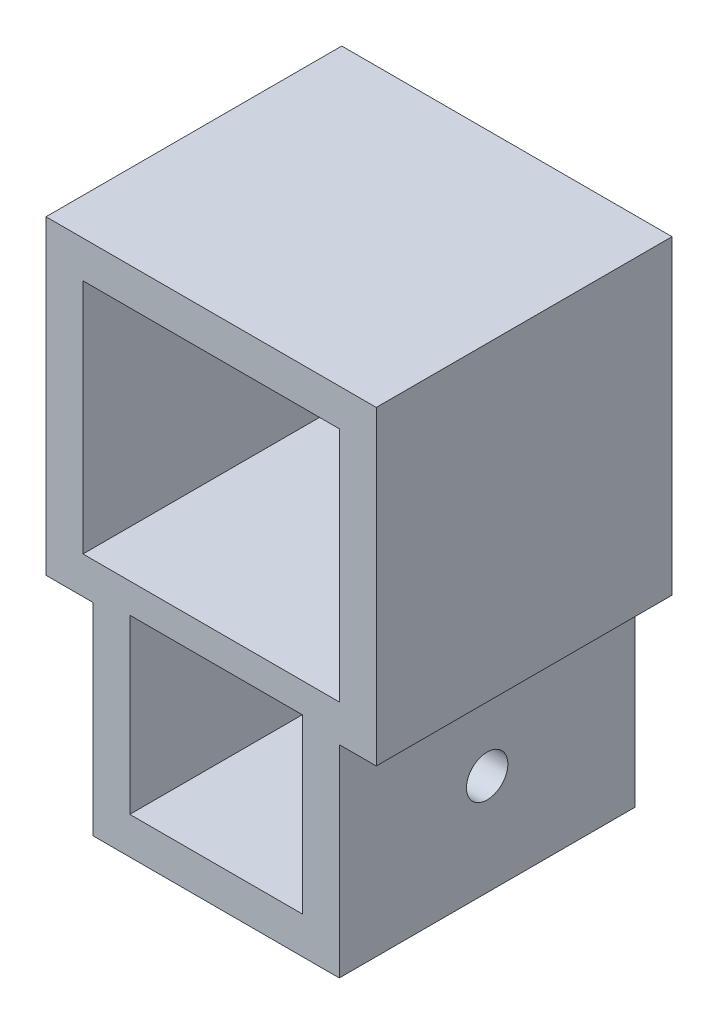
ISO-10303-21;
HEADER;
FILE_DESCRIPTION(('STEP AP214'),'2;1');
FILE_NAME('part.step','',(''),(''),'','','');
FILE_SCHEMA(('AUTOMOTIVE_DESIGN { 1 0 10303 214 1 1 1 1 }'));
ENDSEC;
DATA;
#1=APPLICATION_CONTEXT('core data for automotive mechanical design processes');
#2=APPLICATION_PROTOCOL_DEFINITION('international standard','automotive_design',2000,#1);
#3=PRODUCT_CONTEXT('',#1,'mechanical');
#4=PRODUCT('Part','Part','',(#3));
#5=PRODUCT_RELATED_PRODUCT_CATEGORY('part','',(#4));
#6=PRODUCT_DEFINITION_FORMATION('','',#4);
#7=PRODUCT_DEFINITION_CONTEXT('part definition',#1,'design');
#8=PRODUCT_DEFINITION('design','',#6,#7);
#9=PRODUCT_DEFINITION_SHAPE('','',#8);
#10=(LENGTH_UNIT() NAMED_UNIT(*) SI_UNIT(.MILLI.,.METRE.));
#11=(NAMED_UNIT(*) PLANE_ANGLE_UNIT() SI_UNIT($,.RADIAN.));
#12=(NAMED_UNIT(*) SI_UNIT($,.STERADIAN.) SOLID_ANGLE_UNIT());
#13=UNCERTAINTY_MEASURE_WITH_UNIT(LENGTH_MEASURE(1.E-05),#10,'distance_accuracy_value','');
#14=(GEOMETRIC_REPRESENTATION_CONTEXT(3) GLOBAL_UNCERTAINTY_ASSIGNED_CONTEXT((#13)) GLOBAL_UNIT_ASSIGNED_CONTEXT((#10,
#11,#12)) REPRESENTATION_CONTEXT('',''));
#15=CARTESIAN_POINT('',(0.,0.,0.));
#16=DIRECTION('',(0.,0.,1.));
#17=DIRECTION('',(1.,0.,0.));
#18=AXIS2_PLACEMENT_3D('',#15,#16,#17);
#19=CARTESIAN_POINT('',(0.,0.,30.));
#20=DIRECTION('',(0.,0.,-1.));
#21=DIRECTION('',(-1.,0.,0.));
#22=AXIS2_PLACEMENT_3D('',#19,#20,#21);
#23=PLANE('',#22);
#24=DIRECTION('',(0.,-1.,0.));
#25=VECTOR('',#24,1.);
#26=CARTESIAN_POINT('',(-25.,15.4435483870968,30.));
#27=LINE('',#26,#25);
#28=CARTESIAN_POINT('',(-25.,16.1935483870968,30.));
#29=VERTEX_POINT('',#28);
#30=CARTESIAN_POINT('',(-25.,-1.30645161290323,30.));
#31=VERTEX_POINT('',#30);
#32=EDGE_CURVE('E182',#29,#31,#27,.T.);
#33=ORIENTED_EDGE('',*,*,#32,.F.);
#34=DIRECTION('',(-1.,0.,0.));
#35=VECTOR('',#34,1.);
#36=CARTESIAN_POINT('',(-25.,16.1935483870968,30.));
#37=LINE('',#36,#35);
#38=CARTESIAN_POINT('',(-7.49999999999999,16.1935483870968,30.));
#39=VERTEX_POINT('',#38);
#40=EDGE_CURVE('E190',#39,#29,#37,.T.);
#41=ORIENTED_EDGE('',*,*,#40,.F.);
#42=DIRECTION('',(0.,1.,0.));
#43=VECTOR('',#42,1.);
#44=CARTESIAN_POINT('',(-7.49999999999999,15.4435483870968,30.));
#45=LINE('',#44,#43);
#46=CARTESIAN_POINT('',(-7.49999999999999,-1.30645161290323,30.));
#47=VERTEX_POINT('',#46);
#48=EDGE_CURVE('E187',#47,#39,#45,.T.);
#49=ORIENTED_EDGE('',*,*,#48,.F.);
#50=DIRECTION('',(1.,0.,0.));
#51=VECTOR('',#50,1.);
#52=CARTESIAN_POINT('',(-25.,-1.30645161290323,30.));
#53=LINE('',#52,#51);
#54=EDGE_CURVE('E184',#31,#47,#53,.T.);
#55=ORIENTED_EDGE('',*,*,#54,.F.);
#56=EDGE_LOOP('',(#33,#41,#49,#55));
#57=FACE_BOUND('',#56,.T.);
#58=DIRECTION('',(1.,0.,0.));
#59=VECTOR('',#58,1.);
#60=CARTESIAN_POINT('',(-28.75,15.4435483870968,30.));
#61=LINE('',#60,#59);
#62=CARTESIAN_POINT('',(-33.5,15.4435483870968,30.));
#63=VERTEX_POINT('',#62);
#64=CARTESIAN_POINT('',(-28.75,15.4435483870968,30.));
#65=VERTEX_POINT('',#64);
#66=EDGE_CURVE('E212',#63,#65,#61,.T.);
#67=ORIENTED_EDGE('',*,*,#66,.T.);
#68=DIRECTION('',(0.,-1.,0.));
#69=VECTOR('',#68,1.);
#70=CARTESIAN_POINT('',(-28.75,15.4435483870968,30.));
#71=LINE('',#70,#69);
#72=CARTESIAN_POINT('',(-28.75,-5.05645161290323,30.));
#73=VERTEX_POINT('',#72);
#74=EDGE_CURVE('E215',#65,#73,#71,.T.);
#75=ORIENTED_EDGE('',*,*,#74,.T.);
#76=DIRECTION('',(1.,0.,0.));
#77=VECTOR('',#76,1.);
#78=CARTESIAN_POINT('',(-28.75,-5.05645161290323,30.));
#79=LINE('',#78,#77);
#80=CARTESIAN_POINT('',(-3.74999999999998,-5.05645161290323,30.));
#81=VERTEX_POINT('',#80);
#82=EDGE_CURVE('E218',#73,#81,#79,.T.);
#83=ORIENTED_EDGE('',*,*,#82,.T.);
#84=DIRECTION('',(0.,1.,0.));
#85=VECTOR('',#84,1.);
#86=CARTESIAN_POINT('',(-3.74999999999999,15.4435483870968,30.));
#87=LINE('',#86,#85);
#88=CARTESIAN_POINT('',(-3.74999999999999,15.4435483870968,30.));
#89=VERTEX_POINT('',#88);
#90=EDGE_CURVE('E220',#81,#89,#87,.T.);
#91=ORIENTED_EDGE('',*,*,#90,.T.);
#92=DIRECTION('',(1.,0.,0.));
#93=VECTOR('',#92,1.);
#94=CARTESIAN_POINT('',(0.,15.4435483870968,30.));
#95=LINE('',#94,#93);
#96=CARTESIAN_POINT('',(0.,15.4435483870968,30.));
#97=VERTEX_POINT('',#96);
#98=EDGE_CURVE('E222',#89,#97,#95,.T.);
#99=ORIENTED_EDGE('',*,*,#98,.T.);
#100=DIRECTION('',(0.,1.,0.));
#101=VECTOR('',#100,1.);
#102=CARTESIAN_POINT('',(0.,46.9435483870968,30.));
#103=LINE('',#102,#101);
#104=CARTESIAN_POINT('',(0.,46.9435483870968,30.));
#105=VERTEX_POINT('',#104);
#106=EDGE_CURVE('E224',#97,#105,#103,.T.);
#107=ORIENTED_EDGE('',*,*,#106,.T.);
#108=DIRECTION('',(-1.,0.,0.));
#109=VECTOR('',#108,1.);
#110=CARTESIAN_POINT('',(-33.5,46.9435483870968,30.));
#111=LINE('',#110,#109);
#112=CARTESIAN_POINT('',(-33.5,46.9435483870968,30.));
#113=VERTEX_POINT('',#112);
#114=EDGE_CURVE('E226',#105,#113,#111,.T.);
#115=ORIENTED_EDGE('',*,*,#114,.T.);
#116=DIRECTION('',(0.,-1.,0.));
#117=VECTOR('',#116,1.);
#118=CARTESIAN_POINT('',(-33.5,15.4435483870968,30.));
#119=LINE('',#118,#117);
#120=EDGE_CURVE('E228',#113,#63,#119,.T.);
#121=ORIENTED_EDGE('',*,*,#120,.T.);
#122=EDGE_LOOP('',(#67,#75,#83,#91,#99,#107,#115,#121));
#123=FACE_BOUND('',#122,.T.);
#124=DIRECTION('',(0.,1.,0.));
#125=VECTOR('',#124,1.);
#126=CARTESIAN_POINT('',(-3.75,43.1935483870968,30.));
#127=LINE('',#126,#125);
#128=CARTESIAN_POINT('',(-3.74999999999999,19.1935483870968,30.));
#129=VERTEX_POINT('',#128);
#130=CARTESIAN_POINT('',(-3.75,43.1935483870968,30.));
#131=VERTEX_POINT('',#130);
#132=EDGE_CURVE('E153',#129,#131,#127,.T.);
#133=ORIENTED_EDGE('',*,*,#132,.F.);
#134=DIRECTION('',(1.,0.,0.));
#135=VECTOR('',#134,1.);
#136=CARTESIAN_POINT('',(-25.,19.1935483870968,30.));
#137=LINE('',#136,#135);
#138=CARTESIAN_POINT('',(-29.75,19.1935483870968,30.));
#139=VERTEX_POINT('',#138);
#140=EDGE_CURVE('E146',#139,#129,#137,.T.);
#141=ORIENTED_EDGE('',*,*,#140,.F.);
#142=DIRECTION('',(0.,-1.,0.));
#143=VECTOR('',#142,1.);
#144=CARTESIAN_POINT('',(-29.75,19.1935483870968,30.));
#145=LINE('',#144,#143);
#146=CARTESIAN_POINT('',(-29.75,43.1935483870968,30.));
#147=VERTEX_POINT('',#146);
#148=EDGE_CURVE('E164',#147,#139,#145,.T.);
#149=ORIENTED_EDGE('',*,*,#148,.F.);
#150=DIRECTION('',(-1.,0.,0.));
#151=VECTOR('',#150,1.);
#152=CARTESIAN_POINT('',(-29.75,43.1935483870968,30.));
#153=LINE('',#152,#151);
#154=EDGE_CURVE('E162',#131,#147,#153,.T.);
#155=ORIENTED_EDGE('',*,*,#154,.F.);
#156=EDGE_LOOP('',(#133,#141,#149,#155));
#157=FACE_BOUND('',#156,.T.);
#158=ADVANCED_FACE('F33',(#57,#123,#157),#23,.F.);
#159=CARTESIAN_POINT('',(0.,0.,0.));
#160=DIRECTION('',(0.,0.,-1.));
#161=DIRECTION('',(-1.,0.,0.));
#162=AXIS2_PLACEMENT_3D('',#159,#160,#161);
#163=PLANE('',#162);
#164=DIRECTION('',(1.,0.,0.));
#165=VECTOR('',#164,1.);
#166=CARTESIAN_POINT('',(-28.75,15.4435483870968,0.));
#167=LINE('',#166,#165);
#168=CARTESIAN_POINT('',(-33.5,15.4435483870968,0.));
#169=VERTEX_POINT('',#168);
#170=CARTESIAN_POINT('',(-28.75,15.4435483870968,0.));
#171=VERTEX_POINT('',#170);
#172=EDGE_CURVE('E211',#169,#171,#167,.T.);
#173=ORIENTED_EDGE('',*,*,#172,.F.);
#174=DIRECTION('',(0.,-1.,0.));
#175=VECTOR('',#174,1.);
#176=CARTESIAN_POINT('',(-33.5,15.4435483870968,0.));
#177=LINE('',#176,#175);
#178=CARTESIAN_POINT('',(-33.5,46.9435483870968,0.));
#179=VERTEX_POINT('',#178);
#180=EDGE_CURVE('E216',#179,#169,#177,.T.);
#181=ORIENTED_EDGE('',*,*,#180,.F.);
#182=DIRECTION('',(-1.,0.,0.));
#183=VECTOR('',#182,1.);
#184=CARTESIAN_POINT('',(-33.5,46.9435483870968,0.));
#185=LINE('',#184,#183);
#186=CARTESIAN_POINT('',(0.,46.9435483870968,0.));
#187=VERTEX_POINT('',#186);
#188=EDGE_CURVE('E243',#187,#179,#185,.T.);
#189=ORIENTED_EDGE('',*,*,#188,.F.);
#190=DIRECTION('',(0.,1.,0.));
#191=VECTOR('',#190,1.);
#192=CARTESIAN_POINT('',(0.,46.9435483870968,0.));
#193=LINE('',#192,#191);
#194=CARTESIAN_POINT('',(0.,15.4435483870968,0.));
#195=VERTEX_POINT('',#194);
#196=EDGE_CURVE('E241',#195,#187,#193,.T.);
#197=ORIENTED_EDGE('',*,*,#196,.F.);
#198=DIRECTION('',(1.,0.,0.));
#199=VECTOR('',#198,1.);
#200=CARTESIAN_POINT('',(0.,15.4435483870968,0.));
#201=LINE('',#200,#199);
#202=CARTESIAN_POINT('',(-3.74999999999999,15.4435483870968,0.));
#203=VERTEX_POINT('',#202);
#204=EDGE_CURVE('E239',#203,#195,#201,.T.);
#205=ORIENTED_EDGE('',*,*,#204,.F.);
#206=DIRECTION('',(0.,1.,0.));
#207=VECTOR('',#206,1.);
#208=CARTESIAN_POINT('',(-3.74999999999999,15.4435483870968,0.));
#209=LINE('',#208,#207);
#210=CARTESIAN_POINT('',(-3.74999999999998,-5.05645161290323,0.));
#211=VERTEX_POINT('',#210);
#212=EDGE_CURVE('E237',#211,#203,#209,.T.);
#213=ORIENTED_EDGE('',*,*,#212,.F.);
#214=DIRECTION('',(1.,0.,0.));
#215=VECTOR('',#214,1.);
#216=CARTESIAN_POINT('',(-28.75,-5.05645161290323,0.));
#217=LINE('',#216,#215);
#218=CARTESIAN_POINT('',(-28.75,-5.05645161290323,0.));
#219=VERTEX_POINT('',#218);
#220=EDGE_CURVE('E235',#219,#211,#217,.T.);
#221=ORIENTED_EDGE('',*,*,#220,.F.);
#222=DIRECTION('',(0.,-1.,0.));
#223=VECTOR('',#222,1.);
#224=CARTESIAN_POINT('',(-28.75,15.4435483870968,0.));
#225=LINE('',#224,#223);
#226=EDGE_CURVE('E233',#171,#219,#225,.T.);
#227=ORIENTED_EDGE('',*,*,#226,.F.);
#228=EDGE_LOOP('',(#173,#181,#189,#197,#205,#213,#221,#227));
#229=FACE_BOUND('',#228,.T.);
#230=DIRECTION('',(-1.,0.,0.));
#231=VECTOR('',#230,1.);
#232=CARTESIAN_POINT('',(-25.,16.1935483870968,0.));
#233=LINE('',#232,#231);
#234=CARTESIAN_POINT('',(-7.49999999999999,16.1935483870968,0.));
#235=VERTEX_POINT('',#234);
#236=CARTESIAN_POINT('',(-25.,16.1935483870968,0.));
#237=VERTEX_POINT('',#236);
#238=EDGE_CURVE('E185',#235,#237,#233,.T.);
#239=ORIENTED_EDGE('',*,*,#238,.T.);
#240=DIRECTION('',(0.,-1.,0.));
#241=VECTOR('',#240,1.);
#242=CARTESIAN_POINT('',(-25.,15.4435483870968,0.));
#243=LINE('',#242,#241);
#244=CARTESIAN_POINT('',(-25.,-1.30645161290323,0.));
#245=VERTEX_POINT('',#244);
#246=EDGE_CURVE('E158',#237,#245,#243,.T.);
#247=ORIENTED_EDGE('',*,*,#246,.T.);
#248=DIRECTION('',(1.,0.,0.));
#249=VECTOR('',#248,1.);
#250=CARTESIAN_POINT('',(-25.,-1.30645161290323,0.));
#251=LINE('',#250,#249);
#252=CARTESIAN_POINT('',(-7.49999999999999,-1.30645161290323,0.));
#253=VERTEX_POINT('',#252);
#254=EDGE_CURVE('E195',#245,#253,#251,.T.);
#255=ORIENTED_EDGE('',*,*,#254,.T.);
#256=DIRECTION('',(0.,1.,0.));
#257=VECTOR('',#256,1.);
#258=CARTESIAN_POINT('',(-7.49999999999999,16.1935483870968,0.));
#259=LINE('',#258,#257);
#260=EDGE_CURVE('E198',#253,#235,#259,.T.);
#261=ORIENTED_EDGE('',*,*,#260,.T.);
#262=EDGE_LOOP('',(#239,#247,#255,#261));
#263=FACE_BOUND('',#262,.T.);
#264=DIRECTION('',(1.,0.,0.));
#265=VECTOR('',#264,1.);
#266=CARTESIAN_POINT('',(-25.,19.1935483870968,0.));
#267=LINE('',#266,#265);
#268=CARTESIAN_POINT('',(-29.75,19.1935483870968,0.));
#269=VERTEX_POINT('',#268);
#270=CARTESIAN_POINT('',(-3.74999999999999,19.1935483870968,0.));
#271=VERTEX_POINT('',#270);
#272=EDGE_CURVE('E154',#269,#271,#267,.T.);
#273=ORIENTED_EDGE('',*,*,#272,.T.);
#274=DIRECTION('',(0.,1.,0.));
#275=VECTOR('',#274,1.);
#276=CARTESIAN_POINT('',(-3.75,43.1935483870968,0.));
#277=LINE('',#276,#275);
#278=CARTESIAN_POINT('',(-3.75,43.1935483870968,0.));
#279=VERTEX_POINT('',#278);
#280=EDGE_CURVE('E57',#271,#279,#277,.T.);
#281=ORIENTED_EDGE('',*,*,#280,.T.);
#282=DIRECTION('',(-1.,0.,0.));
#283=VECTOR('',#282,1.);
#284=CARTESIAN_POINT('',(-29.75,43.1935483870968,0.));
#285=LINE('',#284,#283);
#286=CARTESIAN_POINT('',(-29.75,43.1935483870968,0.));
#287=VERTEX_POINT('',#286);
#288=EDGE_CURVE('E170',#279,#287,#285,.T.);
#289=ORIENTED_EDGE('',*,*,#288,.T.);
#290=DIRECTION('',(0.,-1.,0.));
#291=VECTOR('',#290,1.);
#292=CARTESIAN_POINT('',(-29.75,19.1935483870968,0.));
#293=LINE('',#292,#291);
#294=EDGE_CURVE('E174',#287,#269,#293,.T.);
#295=ORIENTED_EDGE('',*,*,#294,.T.);
#296=EDGE_LOOP('',(#273,#281,#289,#295));
#297=FACE_BOUND('',#296,.T.);
#298=ADVANCED_FACE('F274',(#229,#263,#297),#163,.T.);
#299=CARTESIAN_POINT('',(-28.75,15.4435483870968,30.));
#300=DIRECTION('',(0.,1.,0.));
#301=DIRECTION('',(0.,0.,1.));
#302=AXIS2_PLACEMENT_3D('',#299,#300,#301);
#303=PLANE('',#302);
#304=ORIENTED_EDGE('',*,*,#172,.T.);
#305=DIRECTION('',(0.,0.,-1.));
#306=VECTOR('',#305,1.);
#307=CARTESIAN_POINT('',(-28.75,15.4435483870968,30.));
#308=LINE('',#307,#306);
#309=EDGE_CURVE('E11',#65,#171,#308,.T.);
#310=ORIENTED_EDGE('',*,*,#309,.F.);
#311=ORIENTED_EDGE('',*,*,#66,.F.);
#312=DIRECTION('',(0.,0.,-1.));
#313=VECTOR('',#312,1.);
#314=CARTESIAN_POINT('',(-33.5,15.4435483870968,30.));
#315=LINE('',#314,#313);
#316=EDGE_CURVE('E230',#63,#169,#315,.T.);
#317=ORIENTED_EDGE('',*,*,#316,.T.);
#318=EDGE_LOOP('',(#304,#310,#311,#317));
#319=FACE_BOUND('',#318,.T.);
#320=ADVANCED_FACE('F35',(#319),#303,.F.);
#321=CARTESIAN_POINT('',(-28.75,15.4435483870968,30.));
#322=DIRECTION('',(1.,0.,0.));
#323=DIRECTION('',(0.,1.,0.));
#324=AXIS2_PLACEMENT_3D('',#321,#322,#323);
#325=PLANE('',#324);
#326=CARTESIAN_POINT('',(-28.75,5.19354838709677,15.));
#327=DIRECTION('',(-1.,0.,0.));
#328=DIRECTION('',(0.,-1.,0.));
#329=AXIS2_PLACEMENT_3D('',#326,#327,#328);
#330=CIRCLE('',#329,2.1);
#331=CARTESIAN_POINT('',(-28.75,3.09354838709677,15.));
#332=VERTEX_POINT('',#331);
#333=EDGE_CURVE('E389',#332,#332,#330,.T.);
#334=ORIENTED_EDGE('',*,*,#333,.F.);
#335=EDGE_LOOP('',(#334));
#336=FACE_BOUND('',#335,.T.);
#337=ORIENTED_EDGE('',*,*,#226,.T.);
#338=DIRECTION('',(0.,0.,-1.));
#339=VECTOR('',#338,1.);
#340=CARTESIAN_POINT('',(-28.75,-5.05645161290323,30.));
#341=LINE('',#340,#339);
#342=EDGE_CURVE('E42',#73,#219,#341,.T.);
#343=ORIENTED_EDGE('',*,*,#342,.F.);
#344=ORIENTED_EDGE('',*,*,#74,.F.);
#345=ORIENTED_EDGE('',*,*,#309,.T.);
#346=EDGE_LOOP('',(#337,#343,#344,#345));
#347=FACE_BOUND('',#346,.T.);
#348=ADVANCED_FACE('F291',(#336,#347),#325,.F.);
#349=CARTESIAN_POINT('',(-28.75,-5.05645161290323,30.));
#350=DIRECTION('',(0.,1.,0.));
#351=DIRECTION('',(-1.,0.,0.));
#352=AXIS2_PLACEMENT_3D('',#349,#350,#351);
#353=PLANE('',#352);
#354=ORIENTED_EDGE('',*,*,#220,.T.);
#355=DIRECTION('',(0.,0.,-1.));
#356=VECTOR('',#355,1.);
#357=CARTESIAN_POINT('',(-3.74999999999998,-5.05645161290323,30.));
#358=LINE('',#357,#356);
#359=EDGE_CURVE('E260',#81,#211,#358,.T.);
#360=ORIENTED_EDGE('',*,*,#359,.F.);
#361=ORIENTED_EDGE('',*,*,#82,.F.);
#362=ORIENTED_EDGE('',*,*,#342,.T.);
#363=EDGE_LOOP('',(#354,#360,#361,#362));
#364=FACE_BOUND('',#363,.T.);
#365=ADVANCED_FACE('F268',(#364),#353,.F.);
#366=CARTESIAN_POINT('',(-3.74999999999999,15.4435483870968,30.));
#367=DIRECTION('',(-1.,0.,0.));
#368=DIRECTION('',(0.,-1.,0.));
#369=AXIS2_PLACEMENT_3D('',#366,#367,#368);
#370=PLANE('',#369);
#371=CARTESIAN_POINT('',(-3.74999999999999,5.19354838709678,15.));
#372=DIRECTION('',(-1.,0.,0.));
#373=DIRECTION('',(0.,-1.,0.));
#374=AXIS2_PLACEMENT_3D('',#371,#372,#373);
#375=CIRCLE('',#374,2.1);
#376=CARTESIAN_POINT('',(-3.74999999999999,3.09354838709678,15.));
#377=VERTEX_POINT('',#376);
#378=EDGE_CURVE('E171',#377,#377,#375,.T.);
#379=ORIENTED_EDGE('',*,*,#378,.T.);
#380=EDGE_LOOP('',(#379));
#381=FACE_BOUND('',#380,.T.);
#382=ORIENTED_EDGE('',*,*,#212,.T.);
#383=DIRECTION('',(0.,0.,-1.));
#384=VECTOR('',#383,1.);
#385=CARTESIAN_POINT('',(-3.74999999999999,15.4435483870968,30.));
#386=LINE('',#385,#384);
#387=EDGE_CURVE('E257',#89,#203,#386,.T.);
#388=ORIENTED_EDGE('',*,*,#387,.F.);
#389=ORIENTED_EDGE('',*,*,#90,.F.);
#390=ORIENTED_EDGE('',*,*,#359,.T.);
#391=EDGE_LOOP('',(#382,#388,#389,#390));
#392=FACE_BOUND('',#391,.T.);
#393=ADVANCED_FACE('F280',(#381,#392),#370,.F.);
#394=CARTESIAN_POINT('',(0.,15.4435483870968,30.));
#395=DIRECTION('',(0.,1.,0.));
#396=DIRECTION('',(0.,0.,1.));
#397=AXIS2_PLACEMENT_3D('',#394,#395,#396);
#398=PLANE('',#397);
#399=ORIENTED_EDGE('',*,*,#204,.T.);
#400=DIRECTION('',(0.,0.,-1.));
#401=VECTOR('',#400,1.);
#402=CARTESIAN_POINT('',(0.,15.4435483870968,30.));
#403=LINE('',#402,#401);
#404=EDGE_CURVE('E254',#97,#195,#403,.T.);
#405=ORIENTED_EDGE('',*,*,#404,.F.);
#406=ORIENTED_EDGE('',*,*,#98,.F.);
#407=ORIENTED_EDGE('',*,*,#387,.T.);
#408=EDGE_LOOP('',(#399,#405,#406,#407));
#409=FACE_BOUND('',#408,.T.);
#410=ADVANCED_FACE('F284',(#409),#398,.F.);
#411=CARTESIAN_POINT('',(0.,46.9435483870968,30.));
#412=DIRECTION('',(-1.,0.,0.));
#413=DIRECTION('',(0.,-1.,0.));
#414=AXIS2_PLACEMENT_3D('',#411,#412,#413);
#415=PLANE('',#414);
#416=ORIENTED_EDGE('',*,*,#196,.T.);
#417=DIRECTION('',(0.,0.,-1.));
#418=VECTOR('',#417,1.);
#419=CARTESIAN_POINT('',(0.,46.9435483870968,30.));
#420=LINE('',#419,#418);
#421=EDGE_CURVE('E251',#105,#187,#420,.T.);
#422=ORIENTED_EDGE('',*,*,#421,.F.);
#423=ORIENTED_EDGE('',*,*,#106,.F.);
#424=ORIENTED_EDGE('',*,*,#404,.T.);
#425=EDGE_LOOP('',(#416,#422,#423,#424));
#426=FACE_BOUND('',#425,.T.);
#427=ADVANCED_FACE('F304',(#426),#415,.F.);
#428=CARTESIAN_POINT('',(-33.5,46.9435483870968,30.));
#429=DIRECTION('',(0.,-1.,0.));
#430=DIRECTION('',(0.,0.,-1.));
#431=AXIS2_PLACEMENT_3D('',#428,#429,#430);
#432=PLANE('',#431);
#433=ORIENTED_EDGE('',*,*,#188,.T.);
#434=DIRECTION('',(0.,0.,-1.));
#435=VECTOR('',#434,1.);
#436=CARTESIAN_POINT('',(-33.5,46.9435483870968,30.));
#437=LINE('',#436,#435);
#438=EDGE_CURVE('E248',#113,#179,#437,.T.);
#439=ORIENTED_EDGE('',*,*,#438,.F.);
#440=ORIENTED_EDGE('',*,*,#114,.F.);
#441=ORIENTED_EDGE('',*,*,#421,.T.);
#442=EDGE_LOOP('',(#433,#439,#440,#441));
#443=FACE_BOUND('',#442,.T.);
#444=ADVANCED_FACE('F302',(#443),#432,.F.);
#445=CARTESIAN_POINT('',(-33.5,15.4435483870968,30.));
#446=DIRECTION('',(1.,0.,0.));
#447=DIRECTION('',(0.,0.,-1.));
#448=AXIS2_PLACEMENT_3D('',#445,#446,#447);
#449=PLANE('',#448);
#450=ORIENTED_EDGE('',*,*,#180,.T.);
#451=ORIENTED_EDGE('',*,*,#316,.F.);
#452=ORIENTED_EDGE('',*,*,#120,.F.);
#453=ORIENTED_EDGE('',*,*,#438,.T.);
#454=EDGE_LOOP('',(#450,#451,#452,#453));
#455=FACE_BOUND('',#454,.T.);
#456=ADVANCED_FACE('F297',(#455),#449,.F.);
#457=CARTESIAN_POINT('',(-25.,15.4435483870968,30.));
#458=DIRECTION('',(1.,0.,0.));
#459=DIRECTION('',(0.,1.,0.));
#460=AXIS2_PLACEMENT_3D('',#457,#458,#459);
#461=PLANE('',#460);
#462=CARTESIAN_POINT('',(-25.,5.19354838709677,15.));
#463=DIRECTION('',(1.,0.,0.));
#464=DIRECTION('',(0.,1.,0.));
#465=AXIS2_PLACEMENT_3D('',#462,#463,#464);
#466=CIRCLE('',#465,2.1);
#467=CARTESIAN_POINT('',(-25.,3.09354838709677,15.));
#468=VERTEX_POINT('',#467);
#469=EDGE_CURVE('E339',#468,#468,#466,.T.);
#470=ORIENTED_EDGE('',*,*,#469,.F.);
#471=EDGE_LOOP('',(#470));
#472=FACE_BOUND('',#471,.T.);
#473=ORIENTED_EDGE('',*,*,#246,.F.);
#474=DIRECTION('',(0.,0.,-1.));
#475=VECTOR('',#474,1.);
#476=CARTESIAN_POINT('',(-25.,16.1935483870968,30.));
#477=LINE('',#476,#475);
#478=EDGE_CURVE('E192',#29,#237,#477,.T.);
#479=ORIENTED_EDGE('',*,*,#478,.F.);
#480=ORIENTED_EDGE('',*,*,#32,.T.);
#481=DIRECTION('',(0.,0.,-1.));
#482=VECTOR('',#481,1.);
#483=CARTESIAN_POINT('',(-25.,-1.30645161290323,30.));
#484=LINE('',#483,#482);
#485=EDGE_CURVE('E209',#31,#245,#484,.T.);
#486=ORIENTED_EDGE('',*,*,#485,.T.);
#487=EDGE_LOOP('',(#473,#479,#480,#486));
#488=FACE_BOUND('',#487,.T.);
#489=ADVANCED_FACE('F322',(#472,#488),#461,.T.);
#490=CARTESIAN_POINT('',(-25.,-1.30645161290323,30.));
#491=DIRECTION('',(0.,1.,0.));
#492=DIRECTION('',(0.,0.,1.));
#493=AXIS2_PLACEMENT_3D('',#490,#491,#492);
#494=PLANE('',#493);
#495=ORIENTED_EDGE('',*,*,#254,.F.);
#496=ORIENTED_EDGE('',*,*,#485,.F.);
#497=ORIENTED_EDGE('',*,*,#54,.T.);
#498=DIRECTION('',(0.,0.,-1.));
#499=VECTOR('',#498,1.);
#500=CARTESIAN_POINT('',(-7.49999999999999,-1.30645161290323,30.));
#501=LINE('',#500,#499);
#502=EDGE_CURVE('E206',#47,#253,#501,.T.);
#503=ORIENTED_EDGE('',*,*,#502,.T.);
#504=EDGE_LOOP('',(#495,#496,#497,#503));
#505=FACE_BOUND('',#504,.T.);
#506=ADVANCED_FACE('F329',(#505),#494,.T.);
#507=CARTESIAN_POINT('',(-7.49999999999999,16.1935483870968,30.));
#508=DIRECTION('',(-1.,0.,0.));
#509=DIRECTION('',(0.,-1.,0.));
#510=AXIS2_PLACEMENT_3D('',#507,#508,#509);
#511=PLANE('',#510);
#512=CARTESIAN_POINT('',(-7.5,5.19354838709678,15.));
#513=DIRECTION('',(-1.,0.,0.));
#514=DIRECTION('',(0.,-1.,0.));
#515=AXIS2_PLACEMENT_3D('',#512,#513,#514);
#516=CIRCLE('',#515,2.1);
#517=CARTESIAN_POINT('',(-7.50000000000001,3.09354838709678,15.));
#518=VERTEX_POINT('',#517);
#519=EDGE_CURVE('E37',#518,#518,#516,.T.);
#520=ORIENTED_EDGE('',*,*,#519,.F.);
#521=EDGE_LOOP('',(#520));
#522=FACE_BOUND('',#521,.T.);
#523=ORIENTED_EDGE('',*,*,#260,.F.);
#524=ORIENTED_EDGE('',*,*,#502,.F.);
#525=ORIENTED_EDGE('',*,*,#48,.T.);
#526=DIRECTION('',(0.,0.,-1.));
#527=VECTOR('',#526,1.);
#528=CARTESIAN_POINT('',(-7.49999999999999,16.1935483870968,30.));
#529=LINE('',#528,#527);
#530=EDGE_CURVE('E204',#39,#235,#529,.T.);
#531=ORIENTED_EDGE('',*,*,#530,.T.);
#532=EDGE_LOOP('',(#523,#524,#525,#531));
#533=FACE_BOUND('',#532,.T.);
#534=ADVANCED_FACE('F334',(#522,#533),#511,.T.);
#535=CARTESIAN_POINT('',(-25.,16.1935483870968,30.));
#536=DIRECTION('',(0.,-1.,0.));
#537=DIRECTION('',(0.,0.,-1.));
#538=AXIS2_PLACEMENT_3D('',#535,#536,#537);
#539=PLANE('',#538);
#540=ORIENTED_EDGE('',*,*,#238,.F.);
#541=ORIENTED_EDGE('',*,*,#530,.F.);
#542=ORIENTED_EDGE('',*,*,#40,.T.);
#543=ORIENTED_EDGE('',*,*,#478,.T.);
#544=EDGE_LOOP('',(#540,#541,#542,#543));
#545=FACE_BOUND('',#544,.T.);
#546=ADVANCED_FACE('F347',(#545),#539,.T.);
#547=CARTESIAN_POINT('',(-3.75,43.1935483870968,30.));
#548=DIRECTION('',(-1.,0.,0.));
#549=DIRECTION('',(0.,-1.,0.));
#550=AXIS2_PLACEMENT_3D('',#547,#548,#549);
#551=PLANE('',#550);
#552=ORIENTED_EDGE('',*,*,#280,.F.);
#553=DIRECTION('',(0.,0.,-1.));
#554=VECTOR('',#553,1.);
#555=CARTESIAN_POINT('',(-3.74999999999999,19.1935483870968,30.));
#556=LINE('',#555,#554);
#557=EDGE_CURVE('E148',#129,#271,#556,.T.);
#558=ORIENTED_EDGE('',*,*,#557,.F.);
#559=ORIENTED_EDGE('',*,*,#132,.T.);
#560=DIRECTION('',(0.,0.,-1.));
#561=VECTOR('',#560,1.);
#562=CARTESIAN_POINT('',(-3.75,43.1935483870968,30.));
#563=LINE('',#562,#561);
#564=EDGE_CURVE('E159',#131,#279,#563,.T.);
#565=ORIENTED_EDGE('',*,*,#564,.T.);
#566=EDGE_LOOP('',(#552,#558,#559,#565));
#567=FACE_BOUND('',#566,.T.);
#568=ADVANCED_FACE('F156',(#567),#551,.T.);
#569=CARTESIAN_POINT('',(-29.75,43.1935483870968,30.));
#570=DIRECTION('',(0.,-1.,0.));
#571=DIRECTION('',(0.,0.,-1.));
#572=AXIS2_PLACEMENT_3D('',#569,#570,#571);
#573=PLANE('',#572);
#574=ORIENTED_EDGE('',*,*,#288,.F.);
#575=ORIENTED_EDGE('',*,*,#564,.F.);
#576=ORIENTED_EDGE('',*,*,#154,.T.);
#577=DIRECTION('',(0.,0.,-1.));
#578=VECTOR('',#577,1.);
#579=CARTESIAN_POINT('',(-29.75,43.1935483870968,30.));
#580=LINE('',#579,#578);
#581=EDGE_CURVE('E179',#147,#287,#580,.T.);
#582=ORIENTED_EDGE('',*,*,#581,.T.);
#583=EDGE_LOOP('',(#574,#575,#576,#582));
#584=FACE_BOUND('',#583,.T.);
#585=ADVANCED_FACE('F364',(#584),#573,.T.);
#586=CARTESIAN_POINT('',(-29.75,19.1935483870968,30.));
#587=DIRECTION('',(1.,0.,0.));
#588=DIRECTION('',(0.,0.,-1.));
#589=AXIS2_PLACEMENT_3D('',#586,#587,#588);
#590=PLANE('',#589);
#591=ORIENTED_EDGE('',*,*,#294,.F.);
#592=ORIENTED_EDGE('',*,*,#581,.F.);
#593=ORIENTED_EDGE('',*,*,#148,.T.);
#594=DIRECTION('',(0.,0.,-1.));
#595=VECTOR('',#594,1.);
#596=CARTESIAN_POINT('',(-29.75,19.1935483870968,30.));
#597=LINE('',#596,#595);
#598=EDGE_CURVE('E49',#139,#269,#597,.T.);
#599=ORIENTED_EDGE('',*,*,#598,.T.);
#600=EDGE_LOOP('',(#591,#592,#593,#599));
#601=FACE_BOUND('',#600,.T.);
#602=ADVANCED_FACE('F367',(#601),#590,.T.);
#603=CARTESIAN_POINT('',(-25.,19.1935483870968,30.));
#604=DIRECTION('',(0.,1.,0.));
#605=DIRECTION('',(0.,0.,1.));
#606=AXIS2_PLACEMENT_3D('',#603,#604,#605);
#607=PLANE('',#606);
#608=ORIENTED_EDGE('',*,*,#272,.F.);
#609=ORIENTED_EDGE('',*,*,#598,.F.);
#610=ORIENTED_EDGE('',*,*,#140,.T.);
#611=ORIENTED_EDGE('',*,*,#557,.T.);
#612=EDGE_LOOP('',(#608,#609,#610,#611));
#613=FACE_BOUND('',#612,.T.);
#614=ADVANCED_FACE('F147',(#613),#607,.T.);
#615=CARTESIAN_POINT('',(0.,5.19354838709678,15.));
#616=DIRECTION('',(-1.,0.,0.));
#617=DIRECTION('',(0.,-1.,0.));
#618=AXIS2_PLACEMENT_3D('',#615,#616,#617);
#619=CYLINDRICAL_SURFACE('',#618,2.1);
#620=CARTESIAN_POINT('',(-7.50000000000001,3.09354838709678,15.));
#621=CARTESIAN_POINT('',(-7.46093750000001,3.09354838709678,15.));
#622=CARTESIAN_POINT('',(-7.421875,3.09354838709678,15.));
#623=CARTESIAN_POINT('',(-7.34375,3.09354838709678,15.));
#624=CARTESIAN_POINT('',(-7.3046875,3.09354838709678,15.));
#625=CARTESIAN_POINT('',(-7.2265625,3.09354838709678,15.));
#626=CARTESIAN_POINT('',(-7.1875,3.09354838709678,15.));
#627=CARTESIAN_POINT('',(-7.109375,3.09354838709678,15.));
#628=CARTESIAN_POINT('',(-7.0703125,3.09354838709678,15.));
#629=CARTESIAN_POINT('',(-6.9921875,3.09354838709678,15.));
#630=CARTESIAN_POINT('',(-6.953125,3.09354838709678,15.));
#631=CARTESIAN_POINT('',(-6.875,3.09354838709678,15.));
#632=CARTESIAN_POINT('',(-6.8359375,3.09354838709678,15.));
#633=CARTESIAN_POINT('',(-6.7578125,3.09354838709678,15.));
#634=CARTESIAN_POINT('',(-6.71875,3.09354838709678,15.));
#635=CARTESIAN_POINT('',(-6.640625,3.09354838709678,15.));
#636=CARTESIAN_POINT('',(-6.6015625,3.09354838709678,15.));
#637=CARTESIAN_POINT('',(-6.5234375,3.09354838709678,15.));
#638=CARTESIAN_POINT('',(-6.484375,3.09354838709678,15.));
#639=CARTESIAN_POINT('',(-6.40625,3.09354838709678,15.));
#640=CARTESIAN_POINT('',(-6.3671875,3.09354838709678,15.));
#641=CARTESIAN_POINT('',(-6.2890625,3.09354838709678,15.));
#642=CARTESIAN_POINT('',(-6.25,3.09354838709678,15.));
#643=CARTESIAN_POINT('',(-6.171875,3.09354838709678,15.));
#644=CARTESIAN_POINT('',(-6.1328125,3.09354838709678,15.));
#645=CARTESIAN_POINT('',(-6.0546875,3.09354838709678,15.));
#646=CARTESIAN_POINT('',(-6.015625,3.09354838709678,15.));
#647=CARTESIAN_POINT('',(-5.9375,3.09354838709678,15.));
#648=CARTESIAN_POINT('',(-5.8984375,3.09354838709678,15.));
#649=CARTESIAN_POINT('',(-5.8203125,3.09354838709678,15.));
#650=CARTESIAN_POINT('',(-5.78125,3.09354838709678,15.));
#651=CARTESIAN_POINT('',(-5.703125,3.09354838709678,15.));
#652=CARTESIAN_POINT('',(-5.6640625,3.09354838709678,15.));
#653=CARTESIAN_POINT('',(-5.5859375,3.09354838709678,15.));
#654=CARTESIAN_POINT('',(-5.546875,3.09354838709678,15.));
#655=CARTESIAN_POINT('',(-5.46875,3.09354838709678,15.));
#656=CARTESIAN_POINT('',(-5.42968749999999,3.09354838709678,15.));
#657=CARTESIAN_POINT('',(-5.35156249999999,3.09354838709678,15.));
#658=CARTESIAN_POINT('',(-5.31249999999999,3.09354838709678,15.));
#659=CARTESIAN_POINT('',(-5.23437499999999,3.09354838709678,15.));
#660=CARTESIAN_POINT('',(-5.19531249999999,3.09354838709678,15.));
#661=CARTESIAN_POINT('',(-5.11718749999999,3.09354838709678,15.));
#662=CARTESIAN_POINT('',(-5.07812499999999,3.09354838709678,15.));
#663=CARTESIAN_POINT('',(-4.99999999999999,3.09354838709678,15.));
#664=CARTESIAN_POINT('',(-4.96093749999999,3.09354838709678,15.));
#665=CARTESIAN_POINT('',(-4.88281249999999,3.09354838709678,15.));
#666=CARTESIAN_POINT('',(-4.84374999999999,3.09354838709678,15.));
#667=CARTESIAN_POINT('',(-4.76562499999999,3.09354838709678,15.));
#668=CARTESIAN_POINT('',(-4.72656249999999,3.09354838709678,15.));
#669=CARTESIAN_POINT('',(-4.64843749999999,3.09354838709678,15.));
#670=CARTESIAN_POINT('',(-4.60937499999999,3.09354838709678,15.));
#671=CARTESIAN_POINT('',(-4.53124999999999,3.09354838709678,15.));
#672=CARTESIAN_POINT('',(-4.49218749999999,3.09354838709678,15.));
#673=CARTESIAN_POINT('',(-4.41406249999999,3.09354838709678,15.));
#674=CARTESIAN_POINT('',(-4.37499999999999,3.09354838709678,15.));
#675=CARTESIAN_POINT('',(-4.29687499999999,3.09354838709678,15.));
#676=CARTESIAN_POINT('',(-4.25781249999999,3.09354838709678,15.));
#677=CARTESIAN_POINT('',(-4.17968749999999,3.09354838709678,15.));
#678=CARTESIAN_POINT('',(-4.14062499999999,3.09354838709678,15.));
#679=CARTESIAN_POINT('',(-4.06249999999999,3.09354838709678,15.));
#680=CARTESIAN_POINT('',(-4.02343749999999,3.09354838709678,15.));
#681=CARTESIAN_POINT('',(-3.94531249999999,3.09354838709678,15.));
#682=CARTESIAN_POINT('',(-3.90624999999999,3.09354838709678,15.));
#683=CARTESIAN_POINT('',(-3.82812499999999,3.09354838709678,15.));
#684=CARTESIAN_POINT('',(-3.78906249999999,3.09354838709678,15.));
#685=CARTESIAN_POINT('',(-3.74999999999999,3.09354838709678,15.));
#686=B_SPLINE_CURVE_WITH_KNOTS('',3,(#620,#621,#622,#623,#624,#625,#626,#627,#628,#629,#630,
#631,#632,#633,#634,#635,#636,#637,#638,#639,#640,#641,#642,#643,#644,#645,#646,#647,#648,#649,
#650,#651,#652,#653,#654,#655,#656,#657,#658,#659,#660,#661,#662,#663,#664,#665,#666,#667,#668,
#669,#670,#671,#672,#673,#674,#675,#676,#677,#678,#679,#680,#681,#682,#683,#684,#685),
.UNSPECIFIED.,.F.,.F.,(4,2,2,2,2,2,2,2,2,2,2,2,2,2,2,2,2,2,2,2,2,2,2,2,2,2,2,2,2,2,2,2,4),(0.,
0.117187500000001,0.234375000000001,0.351562500000002,0.468750000000002,0.585937500000003,
0.703125000000003,0.820312500000004,0.937500000000004,1.05468750000001,1.17187500000001,
1.28906250000001,1.40625000000001,1.52343750000001,1.64062500000001,1.75781250000001,
1.87500000000001,1.99218750000001,2.10937500000001,2.22656250000001,2.34375000000001,
2.46093750000001,2.57812500000001,2.69531250000001,2.81250000000001,2.92968750000001,
3.04687500000001,3.16406250000002,3.28125000000002,3.39843750000002,3.51562500000002,
3.63281250000002,3.75000000000002),.UNSPECIFIED.);
#687=EDGE_CURVE('BSEAM374',#518,#377,#686,.T.);
#688=ORIENTED_EDGE('',*,*,#519,.T.);
#689=ORIENTED_EDGE('',*,*,#378,.F.);
#690=ORIENTED_EDGE('',*,*,#687,.T.);
#691=ORIENTED_EDGE('',*,*,#687,.F.);
#692=EDGE_LOOP('',(#688,#690,#689,#691));
#693=FACE_BOUND('',#692,.T.);
#694=ADVANCED_FACE('F374',(#693),#619,.F.);
#695=CARTESIAN_POINT('',(-25.,3.09354838709677,15.));
#696=CARTESIAN_POINT('',(-25.0390625,3.09354838709677,15.));
#697=CARTESIAN_POINT('',(-25.078125,3.09354838709677,15.));
#698=CARTESIAN_POINT('',(-25.15625,3.09354838709677,15.));
#699=CARTESIAN_POINT('',(-25.1953125,3.09354838709677,15.));
#700=CARTESIAN_POINT('',(-25.2734375,3.09354838709677,15.));
#701=CARTESIAN_POINT('',(-25.3125,3.09354838709677,15.));
#702=CARTESIAN_POINT('',(-25.390625,3.09354838709677,15.));
#703=CARTESIAN_POINT('',(-25.4296875,3.09354838709677,15.));
#704=CARTESIAN_POINT('',(-25.5078125,3.09354838709677,15.));
#705=CARTESIAN_POINT('',(-25.546875,3.09354838709677,15.));
#706=CARTESIAN_POINT('',(-25.625,3.09354838709677,15.));
#707=CARTESIAN_POINT('',(-25.6640625,3.09354838709677,15.));
#708=CARTESIAN_POINT('',(-25.7421875,3.09354838709677,15.));
#709=CARTESIAN_POINT('',(-25.78125,3.09354838709677,15.));
#710=CARTESIAN_POINT('',(-25.859375,3.09354838709677,15.));
#711=CARTESIAN_POINT('',(-25.8984375,3.09354838709677,15.));
#712=CARTESIAN_POINT('',(-25.9765625,3.09354838709677,15.));
#713=CARTESIAN_POINT('',(-26.015625,3.09354838709677,15.));
#714=CARTESIAN_POINT('',(-26.09375,3.09354838709677,15.));
#715=CARTESIAN_POINT('',(-26.1328125,3.09354838709677,15.));
#716=CARTESIAN_POINT('',(-26.2109375,3.09354838709677,15.));
#717=CARTESIAN_POINT('',(-26.25,3.09354838709677,15.));
#718=CARTESIAN_POINT('',(-26.328125,3.09354838709677,15.));
#719=CARTESIAN_POINT('',(-26.3671875,3.09354838709677,15.));
#720=CARTESIAN_POINT('',(-26.4453125,3.09354838709677,15.));
#721=CARTESIAN_POINT('',(-26.484375,3.09354838709677,15.));
#722=CARTESIAN_POINT('',(-26.5625,3.09354838709677,15.));
#723=CARTESIAN_POINT('',(-26.6015625,3.09354838709677,15.));
#724=CARTESIAN_POINT('',(-26.6796875,3.09354838709677,15.));
#725=CARTESIAN_POINT('',(-26.71875,3.09354838709677,15.));
#726=CARTESIAN_POINT('',(-26.796875,3.09354838709677,15.));
#727=CARTESIAN_POINT('',(-26.8359375,3.09354838709677,15.));
#728=CARTESIAN_POINT('',(-26.9140625,3.09354838709677,15.));
#729=CARTESIAN_POINT('',(-26.953125,3.09354838709677,15.));
#730=CARTESIAN_POINT('',(-27.03125,3.09354838709677,15.));
#731=CARTESIAN_POINT('',(-27.0703125,3.09354838709677,15.));
#732=CARTESIAN_POINT('',(-27.1484375,3.09354838709677,15.));
#733=CARTESIAN_POINT('',(-27.1875,3.09354838709677,15.));
#734=CARTESIAN_POINT('',(-27.265625,3.09354838709677,15.));
#735=CARTESIAN_POINT('',(-27.3046875,3.09354838709677,15.));
#736=CARTESIAN_POINT('',(-27.3828125,3.09354838709677,15.));
#737=CARTESIAN_POINT('',(-27.421875,3.09354838709677,15.));
#738=CARTESIAN_POINT('',(-27.5,3.09354838709677,15.));
#739=CARTESIAN_POINT('',(-27.5390625,3.09354838709677,15.));
#740=CARTESIAN_POINT('',(-27.6171875,3.09354838709677,15.));
#741=CARTESIAN_POINT('',(-27.65625,3.09354838709677,15.));
#742=CARTESIAN_POINT('',(-27.734375,3.09354838709677,15.));
#743=CARTESIAN_POINT('',(-27.7734375,3.09354838709677,15.));
#744=CARTESIAN_POINT('',(-27.8515625,3.09354838709677,15.));
#745=CARTESIAN_POINT('',(-27.890625,3.09354838709677,15.));
#746=CARTESIAN_POINT('',(-27.96875,3.09354838709677,15.));
#747=CARTESIAN_POINT('',(-28.0078125,3.09354838709677,15.));
#748=CARTESIAN_POINT('',(-28.0859375,3.09354838709677,15.));
#749=CARTESIAN_POINT('',(-28.125,3.09354838709677,15.));
#750=CARTESIAN_POINT('',(-28.203125,3.09354838709677,15.));
#751=CARTESIAN_POINT('',(-28.2421875,3.09354838709677,15.));
#752=CARTESIAN_POINT('',(-28.3203125,3.09354838709677,15.));
#753=CARTESIAN_POINT('',(-28.359375,3.09354838709677,15.));
#754=CARTESIAN_POINT('',(-28.4375,3.09354838709677,15.));
#755=CARTESIAN_POINT('',(-28.4765625,3.09354838709677,15.));
#756=CARTESIAN_POINT('',(-28.5546875,3.09354838709677,15.));
#757=CARTESIAN_POINT('',(-28.59375,3.09354838709677,15.));
#758=CARTESIAN_POINT('',(-28.671875,3.09354838709677,15.));
#759=CARTESIAN_POINT('',(-28.7109375,3.09354838709677,15.));
#760=CARTESIAN_POINT('',(-28.75,3.09354838709677,15.));
#761=B_SPLINE_CURVE_WITH_KNOTS('',3,(#695,#696,#697,#698,#699,#700,#701,#702,#703,#704,#705,
#706,#707,#708,#709,#710,#711,#712,#713,#714,#715,#716,#717,#718,#719,#720,#721,#722,#723,#724,
#725,#726,#727,#728,#729,#730,#731,#732,#733,#734,#735,#736,#737,#738,#739,#740,#741,#742,#743,
#744,#745,#746,#747,#748,#749,#750,#751,#752,#753,#754,#755,#756,#757,#758,#759,#760),
.UNSPECIFIED.,.F.,.F.,(4,2,2,2,2,2,2,2,2,2,2,2,2,2,2,2,2,2,2,2,2,2,2,2,2,2,2,2,2,2,2,2,4),(0.,
0.117187500000001,0.234374999999998,0.351562499999999,0.46875,0.585937499999998,
0.703124999999999,0.8203125,0.937500000000001,1.0546875,1.171875,1.2890625,1.40625,1.5234375,
1.640625,1.7578125,1.875,1.9921875,2.109375,2.2265625,2.34375,2.4609375,2.578125,2.6953125,
2.8125,2.9296875,3.046875,3.1640625,3.28125,3.3984375,3.515625,3.6328125,3.75),.UNSPECIFIED.);
#762=EDGE_CURVE('BSEAM376',#468,#332,#761,.T.);
#763=ORIENTED_EDGE('',*,*,#469,.T.);
#764=ORIENTED_EDGE('',*,*,#333,.T.);
#765=ORIENTED_EDGE('',*,*,#762,.T.);
#766=ORIENTED_EDGE('',*,*,#762,.F.);
#767=EDGE_LOOP('',(#763,#765,#764,#766));
#768=FACE_BOUND('',#767,.T.);
#769=ADVANCED_FACE('F376',(#768),#619,.F.);
#770=CLOSED_SHELL('',(#158,#298,#320,#348,#365,#393,#410,#427,#444,#456,#489,#506,#534,#546,
#568,#585,#602,#614,#694,#769));
#771=MANIFOLD_SOLID_BREP('B2',#770);
#772=ADVANCED_BREP_SHAPE_REPRESENTATION('',(#18,#771),#14);
#773=SHAPE_DEFINITION_REPRESENTATION(#9,#772);
ENDSEC;
END-ISO-10303-21;
